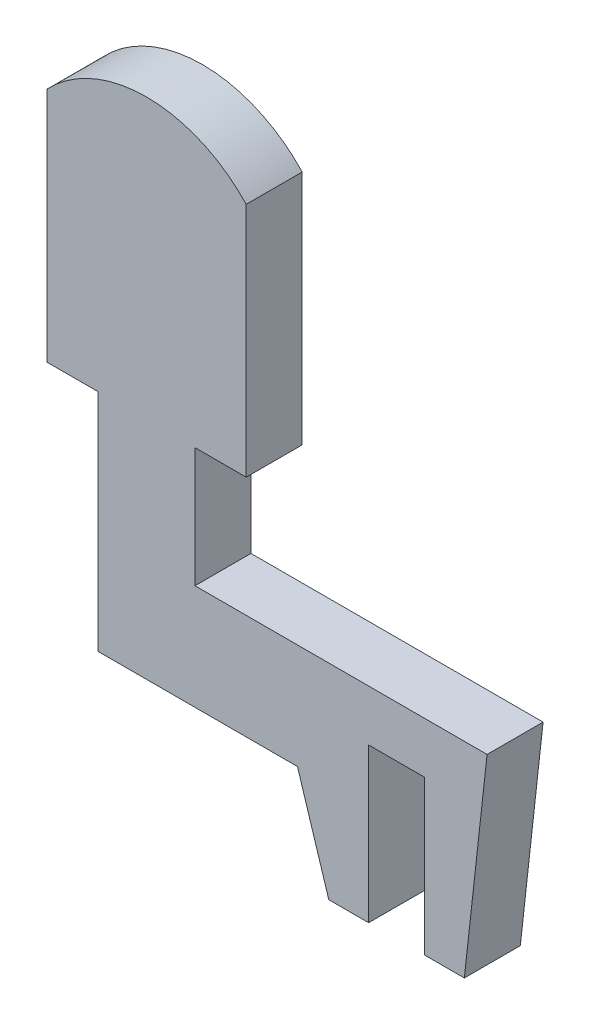
ISO-10303-21;
HEADER;
FILE_DESCRIPTION(('STEP AP214'),'2;1');
FILE_NAME('part.step','',(''),(''),'','','');
FILE_SCHEMA(('AUTOMOTIVE_DESIGN { 1 0 10303 214 1 1 1 1 }'));
ENDSEC;
DATA;
#1=APPLICATION_CONTEXT('core data for automotive mechanical design processes');
#2=APPLICATION_PROTOCOL_DEFINITION('international standard','automotive_design',2000,#1);
#3=PRODUCT_CONTEXT('',#1,'mechanical');
#4=PRODUCT('Part','Part','',(#3));
#5=PRODUCT_RELATED_PRODUCT_CATEGORY('part','',(#4));
#6=PRODUCT_DEFINITION_FORMATION('','',#4);
#7=PRODUCT_DEFINITION_CONTEXT('part definition',#1,'design');
#8=PRODUCT_DEFINITION('design','',#6,#7);
#9=PRODUCT_DEFINITION_SHAPE('','',#8);
#10=(LENGTH_UNIT() NAMED_UNIT(*) SI_UNIT(.MILLI.,.METRE.));
#11=(NAMED_UNIT(*) PLANE_ANGLE_UNIT() SI_UNIT($,.RADIAN.));
#12=(NAMED_UNIT(*) SI_UNIT($,.STERADIAN.) SOLID_ANGLE_UNIT());
#13=UNCERTAINTY_MEASURE_WITH_UNIT(LENGTH_MEASURE(1.E-05),#10,'distance_accuracy_value','');
#14=(GEOMETRIC_REPRESENTATION_CONTEXT(3) GLOBAL_UNCERTAINTY_ASSIGNED_CONTEXT((#13)) GLOBAL_UNIT_ASSIGNED_CONTEXT((#10,
#11,#12)) REPRESENTATION_CONTEXT('',''));
#15=CARTESIAN_POINT('',(0.,0.,0.));
#16=DIRECTION('',(0.,0.,1.));
#17=DIRECTION('',(1.,0.,0.));
#18=AXIS2_PLACEMENT_3D('',#15,#16,#17);
#19=CARTESIAN_POINT('',(540.410759595773,46.3627302296333,3.));
#20=DIRECTION('',(0.,1.,0.));
#21=DIRECTION('',(0.,0.,1.));
#22=AXIS2_PLACEMENT_3D('',#19,#20,#21);
#23=PLANE('',#22);
#24=DIRECTION('',(1.,0.,0.));
#25=VECTOR('',#24,1.);
#26=CARTESIAN_POINT('',(540.410759595773,46.3627302296333,0.));
#27=LINE('',#26,#25);
#28=CARTESIAN_POINT('',(540.410759595773,46.3627302296333,0.));
#29=VERTEX_POINT('',#28);
#30=CARTESIAN_POINT('',(543.156662917581,46.3627302296333,0.));
#31=VERTEX_POINT('',#30);
#32=EDGE_CURVE('E148',#29,#31,#27,.T.);
#33=ORIENTED_EDGE('',*,*,#32,.T.);
#34=DIRECTION('',(0.,0.,-1.));
#35=VECTOR('',#34,1.);
#36=CARTESIAN_POINT('',(543.156662917581,46.3627302296333,2.99999999999995));
#37=LINE('',#36,#35);
#38=CARTESIAN_POINT('',(543.156662917581,46.3627302296333,2.99999999999995));
#39=VERTEX_POINT('',#38);
#40=EDGE_CURVE('E11',#39,#31,#37,.T.);
#41=ORIENTED_EDGE('',*,*,#40,.F.);
#42=DIRECTION('',(1.,0.,0.));
#43=VECTOR('',#42,1.);
#44=CARTESIAN_POINT('',(540.410759595773,46.3627302296333,3.));
#45=LINE('',#44,#43);
#46=CARTESIAN_POINT('',(540.410759595773,46.3627302296333,3.));
#47=VERTEX_POINT('',#46);
#48=EDGE_CURVE('E191',#47,#39,#45,.T.);
#49=ORIENTED_EDGE('',*,*,#48,.F.);
#50=DIRECTION('',(0.,0.,-1.));
#51=VECTOR('',#50,1.);
#52=CARTESIAN_POINT('',(540.410759595773,46.3627302296333,3.));
#53=LINE('',#52,#51);
#54=EDGE_CURVE('E161',#47,#29,#53,.T.);
#55=ORIENTED_EDGE('',*,*,#54,.T.);
#56=EDGE_LOOP('',(#33,#41,#49,#55));
#57=FACE_BOUND('',#56,.T.);
#58=ADVANCED_FACE('F32',(#57),#23,.F.);
#59=CARTESIAN_POINT('',(543.156662917581,46.3627302296333,2.99999999999995));
#60=DIRECTION('',(-1.,0.,0.));
#61=DIRECTION('',(0.,0.,1.));
#62=AXIS2_PLACEMENT_3D('',#59,#60,#61);
#63=PLANE('',#62);
#64=DIRECTION('',(0.,1.,0.));
#65=VECTOR('',#64,1.);
#66=CARTESIAN_POINT('',(543.156662917581,46.3627302296333,0.));
#67=LINE('',#66,#65);
#68=CARTESIAN_POINT('',(543.156662917581,59.0243100628023,0.));
#69=VERTEX_POINT('',#68);
#70=EDGE_CURVE('E144',#31,#69,#67,.T.);
#71=ORIENTED_EDGE('',*,*,#70,.T.);
#72=DIRECTION('',(0.,0.,-1.));
#73=VECTOR('',#72,1.);
#74=CARTESIAN_POINT('',(543.156662917581,59.0243100628023,2.99999999999998));
#75=LINE('',#74,#73);
#76=CARTESIAN_POINT('',(543.156662917581,59.0243100628023,2.99999999999998));
#77=VERTEX_POINT('',#76);
#78=EDGE_CURVE('E39',#77,#69,#75,.T.);
#79=ORIENTED_EDGE('',*,*,#78,.F.);
#80=DIRECTION('',(0.,1.,0.));
#81=VECTOR('',#80,1.);
#82=CARTESIAN_POINT('',(543.156662917581,46.3627302296333,2.99999999999995));
#83=LINE('',#82,#81);
#84=EDGE_CURVE('E157',#39,#77,#83,.T.);
#85=ORIENTED_EDGE('',*,*,#84,.F.);
#86=ORIENTED_EDGE('',*,*,#40,.T.);
#87=EDGE_LOOP('',(#71,#79,#85,#86));
#88=FACE_BOUND('',#87,.T.);
#89=ADVANCED_FACE('F156',(#88),#63,.F.);
#90=CARTESIAN_POINT('',(537.817433657982,54.0155561595769,2.99999999999998));
#91=DIRECTION('',(0.,0.,-1.));
#92=DIRECTION('',(-1.,0.,0.));
#93=AXIS2_PLACEMENT_3D('',#90,#91,#92);
#94=CYLINDRICAL_SURFACE('',#93,7.32085956357776);
#95=CARTESIAN_POINT('',(537.817433657982,54.0155561595769,0.));
#96=DIRECTION('',(0.,0.,1.));
#97=DIRECTION('',(1.,0.,0.));
#98=AXIS2_PLACEMENT_3D('',#95,#96,#97);
#99=CIRCLE('',#98,7.32085956357776);
#100=CARTESIAN_POINT('',(532.478204398384,59.0243100628022,0.));
#101=VERTEX_POINT('',#100);
#102=EDGE_CURVE('E150',#69,#101,#99,.T.);
#103=ORIENTED_EDGE('',*,*,#102,.T.);
#104=DIRECTION('',(0.,0.,-1.));
#105=VECTOR('',#104,1.);
#106=CARTESIAN_POINT('',(532.478204398384,59.0243100628023,2.99999999999998));
#107=LINE('',#106,#105);
#108=CARTESIAN_POINT('',(532.478204398384,59.0243100628023,2.99999999999998));
#109=VERTEX_POINT('',#108);
#110=EDGE_CURVE('E257',#109,#101,#107,.T.);
#111=ORIENTED_EDGE('',*,*,#110,.F.);
#112=CARTESIAN_POINT('',(537.817433657982,54.0155561595769,2.99999999999998));
#113=DIRECTION('',(0.,0.,1.));
#114=DIRECTION('',(1.,0.,0.));
#115=AXIS2_PLACEMENT_3D('',#112,#113,#114);
#116=CIRCLE('',#115,7.32085956357776);
#117=EDGE_CURVE('E194',#77,#109,#116,.T.);
#118=ORIENTED_EDGE('',*,*,#117,.F.);
#119=ORIENTED_EDGE('',*,*,#78,.T.);
#120=EDGE_LOOP('',(#103,#111,#118,#119));
#121=FACE_BOUND('',#120,.T.);
#122=ADVANCED_FACE('F261',(#121),#94,.T.);
#123=CARTESIAN_POINT('',(532.478204398384,46.3627302296333,3.));
#124=DIRECTION('',(1.,0.,0.));
#125=DIRECTION('',(0.,0.,-1.));
#126=AXIS2_PLACEMENT_3D('',#123,#124,#125);
#127=PLANE('',#126);
#128=DIRECTION('',(0.,-1.,0.));
#129=VECTOR('',#128,1.);
#130=CARTESIAN_POINT('',(532.478204398384,46.3627302296333,0.));
#131=LINE('',#130,#129);
#132=CARTESIAN_POINT('',(532.478204398384,46.3627302296333,0.));
#133=VERTEX_POINT('',#132);
#134=EDGE_CURVE('E165',#101,#133,#131,.T.);
#135=ORIENTED_EDGE('',*,*,#134,.T.);
#136=DIRECTION('',(0.,0.,-1.));
#137=VECTOR('',#136,1.);
#138=CARTESIAN_POINT('',(532.478204398384,46.3627302296333,3.));
#139=LINE('',#138,#137);
#140=CARTESIAN_POINT('',(532.478204398384,46.3627302296333,3.));
#141=VERTEX_POINT('',#140);
#142=EDGE_CURVE('E254',#141,#133,#139,.T.);
#143=ORIENTED_EDGE('',*,*,#142,.F.);
#144=DIRECTION('',(0.,-1.,0.));
#145=VECTOR('',#144,1.);
#146=CARTESIAN_POINT('',(532.478204398384,46.5152726429004,3.));
#147=LINE('',#146,#145);
#148=EDGE_CURVE('E196',#109,#141,#147,.T.);
#149=ORIENTED_EDGE('',*,*,#148,.F.);
#150=ORIENTED_EDGE('',*,*,#110,.T.);
#151=EDGE_LOOP('',(#135,#143,#149,#150));
#152=FACE_BOUND('',#151,.T.);
#153=ADVANCED_FACE('F269',(#152),#127,.F.);
#154=CARTESIAN_POINT('',(535.224107720192,46.3627302296333,2.99999999999998));
#155=DIRECTION('',(0.,1.,0.));
#156=DIRECTION('',(0.,0.,1.));
#157=AXIS2_PLACEMENT_3D('',#154,#155,#156);
#158=PLANE('',#157);
#159=DIRECTION('',(1.,0.,0.));
#160=VECTOR('',#159,1.);
#161=CARTESIAN_POINT('',(535.224107720192,46.3627302296333,0.));
#162=LINE('',#161,#160);
#163=CARTESIAN_POINT('',(535.224107720192,46.3627302296333,0.));
#164=VERTEX_POINT('',#163);
#165=EDGE_CURVE('E167',#133,#164,#162,.T.);
#166=ORIENTED_EDGE('',*,*,#165,.T.);
#167=DIRECTION('',(0.,0.,-1.));
#168=VECTOR('',#167,1.);
#169=CARTESIAN_POINT('',(535.224107720192,46.3627302296333,2.99999999999998));
#170=LINE('',#169,#168);
#171=CARTESIAN_POINT('',(535.224107720192,46.3627302296333,2.99999999999998));
#172=VERTEX_POINT('',#171);
#173=EDGE_CURVE('E251',#172,#164,#170,.T.);
#174=ORIENTED_EDGE('',*,*,#173,.F.);
#175=DIRECTION('',(1.,0.,0.));
#176=VECTOR('',#175,1.);
#177=CARTESIAN_POINT('',(535.224107720192,46.3627302296333,2.99999999999998));
#178=LINE('',#177,#176);
#179=EDGE_CURVE('E198',#141,#172,#178,.T.);
#180=ORIENTED_EDGE('',*,*,#179,.F.);
#181=ORIENTED_EDGE('',*,*,#142,.T.);
#182=EDGE_LOOP('',(#166,#174,#180,#181));
#183=FACE_BOUND('',#182,.T.);
#184=ADVANCED_FACE('F272',(#183),#158,.F.);
#185=CARTESIAN_POINT('',(535.224107720192,34.3112501080318,2.99999999999997));
#186=DIRECTION('',(1.,0.,0.));
#187=DIRECTION('',(0.,0.,-1.));
#188=AXIS2_PLACEMENT_3D('',#185,#186,#187);
#189=PLANE('',#188);
#190=DIRECTION('',(0.,-1.,0.));
#191=VECTOR('',#190,1.);
#192=CARTESIAN_POINT('',(535.224107720192,34.3112501080318,0.));
#193=LINE('',#192,#191);
#194=CARTESIAN_POINT('',(535.224107720192,34.3112501080318,0.));
#195=VERTEX_POINT('',#194);
#196=EDGE_CURVE('E169',#164,#195,#193,.T.);
#197=ORIENTED_EDGE('',*,*,#196,.T.);
#198=DIRECTION('',(0.,0.,-1.));
#199=VECTOR('',#198,1.);
#200=CARTESIAN_POINT('',(535.224107720192,34.3112501080318,2.99999999999997));
#201=LINE('',#200,#199);
#202=CARTESIAN_POINT('',(535.224107720192,34.3112501080318,2.99999999999997));
#203=VERTEX_POINT('',#202);
#204=EDGE_CURVE('E248',#203,#195,#201,.T.);
#205=ORIENTED_EDGE('',*,*,#204,.F.);
#206=DIRECTION('',(0.,-1.,0.));
#207=VECTOR('',#206,1.);
#208=CARTESIAN_POINT('',(535.224107720192,34.3112501080318,2.99999999999997));
#209=LINE('',#208,#207);
#210=EDGE_CURVE('E200',#172,#203,#209,.T.);
#211=ORIENTED_EDGE('',*,*,#210,.F.);
#212=ORIENTED_EDGE('',*,*,#173,.T.);
#213=EDGE_LOOP('',(#197,#205,#211,#212));
#214=FACE_BOUND('',#213,.T.);
#215=ADVANCED_FACE('F277',(#214),#189,.F.);
#216=CARTESIAN_POINT('',(545.902566239388,34.3112501080318,2.99999999999999));
#217=DIRECTION('',(0.,1.,0.));
#218=DIRECTION('',(0.,0.,1.));
#219=AXIS2_PLACEMENT_3D('',#216,#217,#218);
#220=PLANE('',#219);
#221=DIRECTION('',(1.,0.,0.));
#222=VECTOR('',#221,1.);
#223=CARTESIAN_POINT('',(545.902566239388,34.3112501080318,0.));
#224=LINE('',#223,#222);
#225=CARTESIAN_POINT('',(545.902566239388,34.3112501080318,0.));
#226=VERTEX_POINT('',#225);
#227=EDGE_CURVE('E171',#195,#226,#224,.T.);
#228=ORIENTED_EDGE('',*,*,#227,.T.);
#229=DIRECTION('',(0.,0.,-1.));
#230=VECTOR('',#229,1.);
#231=CARTESIAN_POINT('',(545.902566239388,34.3112501080318,2.99999999999999));
#232=LINE('',#231,#230);
#233=CARTESIAN_POINT('',(545.902566239388,34.3112501080318,2.99999999999999));
#234=VERTEX_POINT('',#233);
#235=EDGE_CURVE('E245',#234,#226,#232,.T.);
#236=ORIENTED_EDGE('',*,*,#235,.F.);
#237=DIRECTION('',(1.,0.,0.));
#238=VECTOR('',#237,1.);
#239=CARTESIAN_POINT('',(545.902566239388,34.3112501080318,2.99999999999999));
#240=LINE('',#239,#238);
#241=EDGE_CURVE('E202',#203,#234,#240,.T.);
#242=ORIENTED_EDGE('',*,*,#241,.F.);
#243=ORIENTED_EDGE('',*,*,#204,.T.);
#244=EDGE_LOOP('',(#228,#236,#242,#243));
#245=FACE_BOUND('',#244,.T.);
#246=ADVANCED_FACE('F283',(#245),#220,.F.);
#247=CARTESIAN_POINT('',(547.580602726826,28.9720558191837,2.99999999999998));
#248=DIRECTION('',(0.953993512641534,0.299827246656918,0.));
#249=DIRECTION('',(-0.299827246656918,0.953993512641533,0.));
#250=AXIS2_PLACEMENT_3D('',#247,#248,#249);
#251=PLANE('',#250);
#252=DIRECTION('',(0.299827246656918,-0.953993512641533,0.));
#253=VECTOR('',#252,1.);
#254=CARTESIAN_POINT('',(547.580602726826,28.9720558191837,0.));
#255=LINE('',#254,#253);
#256=CARTESIAN_POINT('',(547.580602726826,28.9720558191837,0.));
#257=VERTEX_POINT('',#256);
#258=EDGE_CURVE('E173',#226,#257,#255,.T.);
#259=ORIENTED_EDGE('',*,*,#258,.T.);
#260=DIRECTION('',(0.,0.,-1.));
#261=VECTOR('',#260,1.);
#262=CARTESIAN_POINT('',(547.580602726826,28.9720558191837,2.99999999999998));
#263=LINE('',#262,#261);
#264=CARTESIAN_POINT('',(547.580602726826,28.9720558191837,2.99999999999998));
#265=VERTEX_POINT('',#264);
#266=EDGE_CURVE('E242',#265,#257,#263,.T.);
#267=ORIENTED_EDGE('',*,*,#266,.F.);
#268=DIRECTION('',(0.299827246656918,-0.953993512641533,0.));
#269=VECTOR('',#268,1.);
#270=CARTESIAN_POINT('',(547.580602726826,28.9720558191837,2.99999999999998));
#271=LINE('',#270,#269);
#272=EDGE_CURVE('E204',#234,#265,#271,.T.);
#273=ORIENTED_EDGE('',*,*,#272,.F.);
#274=ORIENTED_EDGE('',*,*,#235,.T.);
#275=EDGE_LOOP('',(#259,#267,#273,#274));
#276=FACE_BOUND('',#275,.T.);
#277=ADVANCED_FACE('F287',(#276),#251,.F.);
#278=CARTESIAN_POINT('',(549.71493756555,28.9698176911579,2.99999999999999));
#279=DIRECTION('',(0.00104862965018185,0.999999450187777,0.));
#280=DIRECTION('',(-0.999999450187778,0.0010486296501819,0.));
#281=AXIS2_PLACEMENT_3D('',#278,#279,#280);
#282=PLANE('',#281);
#283=DIRECTION('',(0.999999450187778,-0.00104862965018185,0.));
#284=VECTOR('',#283,1.);
#285=CARTESIAN_POINT('',(549.71493756555,28.9698176911579,0.));
#286=LINE('',#285,#284);
#287=CARTESIAN_POINT('',(549.71493756555,28.9698176911579,0.));
#288=VERTEX_POINT('',#287);
#289=EDGE_CURVE('E175',#257,#288,#286,.T.);
#290=ORIENTED_EDGE('',*,*,#289,.T.);
#291=DIRECTION('',(0.,0.,-1.));
#292=VECTOR('',#291,1.);
#293=CARTESIAN_POINT('',(549.71493756555,28.9698176911579,2.99999999999999));
#294=LINE('',#293,#292);
#295=CARTESIAN_POINT('',(549.71493756555,28.9698176911579,2.99999999999999));
#296=VERTEX_POINT('',#295);
#297=EDGE_CURVE('E239',#296,#288,#294,.T.);
#298=ORIENTED_EDGE('',*,*,#297,.F.);
#299=DIRECTION('',(0.999999450187778,-0.00104862965018185,0.));
#300=VECTOR('',#299,1.);
#301=CARTESIAN_POINT('',(549.71493756555,28.9698176911579,2.99999999999999));
#302=LINE('',#301,#300);
#303=EDGE_CURVE('E206',#265,#296,#302,.T.);
#304=ORIENTED_EDGE('',*,*,#303,.F.);
#305=ORIENTED_EDGE('',*,*,#266,.T.);
#306=EDGE_LOOP('',(#290,#298,#304,#305));
#307=FACE_BOUND('',#306,.T.);
#308=ADVANCED_FACE('F292',(#307),#282,.F.);
#309=CARTESIAN_POINT('',(549.71493756555,37.2198176911579,3.));
#310=DIRECTION('',(-1.,0.,0.));
#311=DIRECTION('',(0.,0.,1.));
#312=AXIS2_PLACEMENT_3D('',#309,#310,#311);
#313=PLANE('',#312);
#314=DIRECTION('',(0.,1.,0.));
#315=VECTOR('',#314,1.);
#316=CARTESIAN_POINT('',(549.71493756555,37.2198176911578,0.));
#317=LINE('',#316,#315);
#318=CARTESIAN_POINT('',(549.71493756555,37.2198176911578,0.));
#319=VERTEX_POINT('',#318);
#320=EDGE_CURVE('E177',#288,#319,#317,.T.);
#321=ORIENTED_EDGE('',*,*,#320,.T.);
#322=DIRECTION('',(0.,0.,-1.));
#323=VECTOR('',#322,1.);
#324=CARTESIAN_POINT('',(549.71493756555,37.2198176911579,3.));
#325=LINE('',#324,#323);
#326=CARTESIAN_POINT('',(549.71493756555,37.2198176911579,3.));
#327=VERTEX_POINT('',#326);
#328=EDGE_CURVE('E236',#327,#319,#325,.T.);
#329=ORIENTED_EDGE('',*,*,#328,.F.);
#330=DIRECTION('',(0.,1.,0.));
#331=VECTOR('',#330,1.);
#332=CARTESIAN_POINT('',(549.71493756555,37.2198176911579,3.));
#333=LINE('',#332,#331);
#334=EDGE_CURVE('E208',#296,#327,#333,.T.);
#335=ORIENTED_EDGE('',*,*,#334,.F.);
#336=ORIENTED_EDGE('',*,*,#297,.T.);
#337=EDGE_LOOP('',(#321,#329,#335,#336));
#338=FACE_BOUND('',#337,.T.);
#339=ADVANCED_FACE('F298',(#338),#313,.F.);
#340=CARTESIAN_POINT('',(552.71493756555,37.2198176911578,2.99999999999999));
#341=DIRECTION('',(0.,1.,0.));
#342=DIRECTION('',(0.,0.,1.));
#343=AXIS2_PLACEMENT_3D('',#340,#341,#342);
#344=PLANE('',#343);
#345=DIRECTION('',(1.,0.,0.));
#346=VECTOR('',#345,1.);
#347=CARTESIAN_POINT('',(552.71493756555,37.2198176911578,0.));
#348=LINE('',#347,#346);
#349=CARTESIAN_POINT('',(552.71493756555,37.2198176911578,0.));
#350=VERTEX_POINT('',#349);
#351=EDGE_CURVE('E179',#319,#350,#348,.T.);
#352=ORIENTED_EDGE('',*,*,#351,.T.);
#353=DIRECTION('',(0.,0.,-1.));
#354=VECTOR('',#353,1.);
#355=CARTESIAN_POINT('',(552.71493756555,37.2198176911578,2.99999999999999));
#356=LINE('',#355,#354);
#357=CARTESIAN_POINT('',(552.71493756555,37.2198176911578,2.99999999999999));
#358=VERTEX_POINT('',#357);
#359=EDGE_CURVE('E233',#358,#350,#356,.T.);
#360=ORIENTED_EDGE('',*,*,#359,.F.);
#361=DIRECTION('',(1.,0.,0.));
#362=VECTOR('',#361,1.);
#363=CARTESIAN_POINT('',(552.71493756555,37.2198176911578,2.99999999999999));
#364=LINE('',#363,#362);
#365=EDGE_CURVE('E210',#327,#358,#364,.T.);
#366=ORIENTED_EDGE('',*,*,#365,.F.);
#367=ORIENTED_EDGE('',*,*,#328,.T.);
#368=EDGE_LOOP('',(#352,#360,#366,#367));
#369=FACE_BOUND('',#368,.T.);
#370=ADVANCED_FACE('F302',(#369),#344,.F.);
#371=CARTESIAN_POINT('',(552.70789796037,28.9698206945548,2.99999999999998));
#372=DIRECTION('',(0.999999635951882,-0.000853285476404508,0.));
#373=DIRECTION('',(0.000853285476404425,0.999999635951882,0.));
#374=AXIS2_PLACEMENT_3D('',#371,#372,#373);
#375=PLANE('',#374);
#376=DIRECTION('',(-0.000853285476404453,-0.999999635951881,0.));
#377=VECTOR('',#376,1.);
#378=CARTESIAN_POINT('',(552.70789796037,28.9698206945548,0.));
#379=LINE('',#378,#377);
#380=CARTESIAN_POINT('',(552.70789796037,28.9698206945548,0.));
#381=VERTEX_POINT('',#380);
#382=EDGE_CURVE('E181',#350,#381,#379,.T.);
#383=ORIENTED_EDGE('',*,*,#382,.T.);
#384=DIRECTION('',(0.,0.,-1.));
#385=VECTOR('',#384,1.);
#386=CARTESIAN_POINT('',(552.70789796037,28.9698206945548,2.99999999999998));
#387=LINE('',#386,#385);
#388=CARTESIAN_POINT('',(552.70789796037,28.9698206945548,2.99999999999998));
#389=VERTEX_POINT('',#388);
#390=EDGE_CURVE('E230',#389,#381,#387,.T.);
#391=ORIENTED_EDGE('',*,*,#390,.F.);
#392=DIRECTION('',(-0.000853285476404453,-0.999999635951881,0.));
#393=VECTOR('',#392,1.);
#394=CARTESIAN_POINT('',(552.70789796037,28.9698206945548,2.99999999999998));
#395=LINE('',#394,#393);
#396=EDGE_CURVE('E212',#358,#389,#395,.T.);
#397=ORIENTED_EDGE('',*,*,#396,.F.);
#398=ORIENTED_EDGE('',*,*,#359,.T.);
#399=EDGE_LOOP('',(#383,#391,#397,#398));
#400=FACE_BOUND('',#399,.T.);
#401=ADVANCED_FACE('F307',(#400),#375,.F.);
#402=CARTESIAN_POINT('',(554.842233972577,28.9698206945548,2.99999999999998));
#403=DIRECTION('',(0.,1.,0.));
#404=DIRECTION('',(-1.,0.,0.));
#405=AXIS2_PLACEMENT_3D('',#402,#403,#404);
#406=PLANE('',#405);
#407=DIRECTION('',(1.,0.,0.));
#408=VECTOR('',#407,1.);
#409=CARTESIAN_POINT('',(554.842233972577,28.9698206945548,0.));
#410=LINE('',#409,#408);
#411=CARTESIAN_POINT('',(554.842233972577,28.9698206945548,0.));
#412=VERTEX_POINT('',#411);
#413=EDGE_CURVE('E183',#381,#412,#410,.T.);
#414=ORIENTED_EDGE('',*,*,#413,.T.);
#415=DIRECTION('',(0.,0.,-1.));
#416=VECTOR('',#415,1.);
#417=CARTESIAN_POINT('',(554.842233972577,28.9698206945548,2.99999999999998));
#418=LINE('',#417,#416);
#419=CARTESIAN_POINT('',(554.842233972577,28.9698206945548,2.99999999999998));
#420=VERTEX_POINT('',#419);
#421=EDGE_CURVE('E227',#420,#412,#418,.T.);
#422=ORIENTED_EDGE('',*,*,#421,.F.);
#423=DIRECTION('',(1.,0.,0.));
#424=VECTOR('',#423,1.);
#425=CARTESIAN_POINT('',(554.842233972577,28.9698206945548,2.99999999999998));
#426=LINE('',#425,#424);
#427=EDGE_CURVE('E214',#389,#420,#426,.T.);
#428=ORIENTED_EDGE('',*,*,#427,.F.);
#429=ORIENTED_EDGE('',*,*,#390,.T.);
#430=EDGE_LOOP('',(#414,#422,#428,#429));
#431=FACE_BOUND('',#430,.T.);
#432=ADVANCED_FACE('F313',(#431),#406,.F.);
#433=CARTESIAN_POINT('',(556.062643220214,39.9533640402858,3.00000000000002));
#434=DIRECTION('',(-0.993883580309317,0.11043291534472,0.));
#435=DIRECTION('',(-0.110432915344721,-0.993883580309316,0.));
#436=AXIS2_PLACEMENT_3D('',#433,#434,#435);
#437=PLANE('',#436);
#438=DIRECTION('',(0.110432915344721,0.993883580309316,0.));
#439=VECTOR('',#438,1.);
#440=CARTESIAN_POINT('',(556.062643220214,39.9533640402858,0.));
#441=LINE('',#440,#439);
#442=CARTESIAN_POINT('',(556.062643220214,39.9533640402858,0.));
#443=VERTEX_POINT('',#442);
#444=EDGE_CURVE('E185',#412,#443,#441,.T.);
#445=ORIENTED_EDGE('',*,*,#444,.T.);
#446=DIRECTION('',(0.,0.,-1.));
#447=VECTOR('',#446,1.);
#448=CARTESIAN_POINT('',(556.062643220214,39.9533640402858,3.00000000000002));
#449=LINE('',#448,#447);
#450=CARTESIAN_POINT('',(556.062643220214,39.9533640402858,3.00000000000002));
#451=VERTEX_POINT('',#450);
#452=EDGE_CURVE('E224',#451,#443,#449,.T.);
#453=ORIENTED_EDGE('',*,*,#452,.F.);
#454=DIRECTION('',(0.110432915344721,0.993883580309316,0.));
#455=VECTOR('',#454,1.);
#456=CARTESIAN_POINT('',(556.062643220214,39.9533640402858,3.00000000000002));
#457=LINE('',#456,#455);
#458=EDGE_CURVE('E216',#420,#451,#457,.T.);
#459=ORIENTED_EDGE('',*,*,#458,.F.);
#460=ORIENTED_EDGE('',*,*,#421,.T.);
#461=EDGE_LOOP('',(#445,#453,#459,#460));
#462=FACE_BOUND('',#461,.T.);
#463=ADVANCED_FACE('F317',(#462),#437,.F.);
#464=CARTESIAN_POINT('',(540.410759595773,39.9533640402857,3.00000000000002));
#465=DIRECTION('',(0.,-1.,0.));
#466=DIRECTION('',(0.,0.,-1.));
#467=AXIS2_PLACEMENT_3D('',#464,#465,#466);
#468=PLANE('',#467);
#469=DIRECTION('',(-1.,0.,0.));
#470=VECTOR('',#469,1.);
#471=CARTESIAN_POINT('',(540.410759595773,39.9533640402857,0.));
#472=LINE('',#471,#470);
#473=CARTESIAN_POINT('',(540.410759595773,39.9533640402857,0.));
#474=VERTEX_POINT('',#473);
#475=EDGE_CURVE('E187',#443,#474,#472,.T.);
#476=ORIENTED_EDGE('',*,*,#475,.T.);
#477=DIRECTION('',(0.,0.,-1.));
#478=VECTOR('',#477,1.);
#479=CARTESIAN_POINT('',(540.410759595773,39.9533640402857,3.00000000000002));
#480=LINE('',#479,#478);
#481=CARTESIAN_POINT('',(540.410759595773,39.9533640402857,3.00000000000002));
#482=VERTEX_POINT('',#481);
#483=EDGE_CURVE('E221',#482,#474,#480,.T.);
#484=ORIENTED_EDGE('',*,*,#483,.F.);
#485=DIRECTION('',(-1.,0.,0.));
#486=VECTOR('',#485,1.);
#487=CARTESIAN_POINT('',(540.410759595773,39.9533640402857,3.00000000000002));
#488=LINE('',#487,#486);
#489=EDGE_CURVE('E51',#451,#482,#488,.T.);
#490=ORIENTED_EDGE('',*,*,#489,.F.);
#491=ORIENTED_EDGE('',*,*,#452,.T.);
#492=EDGE_LOOP('',(#476,#484,#490,#491));
#493=FACE_BOUND('',#492,.T.);
#494=ADVANCED_FACE('F320',(#493),#468,.F.);
#495=CARTESIAN_POINT('',(540.410759595773,46.3627302296333,3.));
#496=DIRECTION('',(-1.,0.,0.));
#497=DIRECTION('',(0.,0.,1.));
#498=AXIS2_PLACEMENT_3D('',#495,#496,#497);
#499=PLANE('',#498);
#500=DIRECTION('',(0.,1.,0.));
#501=VECTOR('',#500,1.);
#502=CARTESIAN_POINT('',(540.410759595773,46.3627302296333,0.));
#503=LINE('',#502,#501);
#504=EDGE_CURVE('E189',#474,#29,#503,.T.);
#505=ORIENTED_EDGE('',*,*,#504,.T.);
#506=ORIENTED_EDGE('',*,*,#54,.F.);
#507=DIRECTION('',(0.,1.,0.));
#508=VECTOR('',#507,1.);
#509=CARTESIAN_POINT('',(540.410759595773,46.3627302296333,3.));
#510=LINE('',#509,#508);
#511=EDGE_CURVE('E46',#482,#47,#510,.T.);
#512=ORIENTED_EDGE('',*,*,#511,.F.);
#513=ORIENTED_EDGE('',*,*,#483,.T.);
#514=EDGE_LOOP('',(#505,#506,#512,#513));
#515=FACE_BOUND('',#514,.T.);
#516=ADVANCED_FACE('F322',(#515),#499,.F.);
#517=CARTESIAN_POINT('',(537.817433657982,54.0155561595769,2.99999999999998));
#518=DIRECTION('',(0.,0.,1.));
#519=DIRECTION('',(1.,0.,0.));
#520=AXIS2_PLACEMENT_3D('',#517,#518,#519);
#521=PLANE('',#520);
#522=ORIENTED_EDGE('',*,*,#48,.T.);
#523=ORIENTED_EDGE('',*,*,#84,.T.);
#524=ORIENTED_EDGE('',*,*,#117,.T.);
#525=ORIENTED_EDGE('',*,*,#148,.T.);
#526=ORIENTED_EDGE('',*,*,#179,.T.);
#527=ORIENTED_EDGE('',*,*,#210,.T.);
#528=ORIENTED_EDGE('',*,*,#241,.T.);
#529=ORIENTED_EDGE('',*,*,#272,.T.);
#530=ORIENTED_EDGE('',*,*,#303,.T.);
#531=ORIENTED_EDGE('',*,*,#334,.T.);
#532=ORIENTED_EDGE('',*,*,#365,.T.);
#533=ORIENTED_EDGE('',*,*,#396,.T.);
#534=ORIENTED_EDGE('',*,*,#427,.T.);
#535=ORIENTED_EDGE('',*,*,#458,.T.);
#536=ORIENTED_EDGE('',*,*,#489,.T.);
#537=ORIENTED_EDGE('',*,*,#511,.T.);
#538=EDGE_LOOP('',(#522,#523,#524,#525,#526,#527,#528,#529,#530,#531,#532,#533,#534,#535,#536,#537));
#539=FACE_BOUND('',#538,.T.);
#540=ADVANCED_FACE('F264',(#539),#521,.T.);
#541=CARTESIAN_POINT('',(537.817433657982,54.0155561595769,0.));
#542=DIRECTION('',(0.,0.,1.));
#543=DIRECTION('',(1.,0.,0.));
#544=AXIS2_PLACEMENT_3D('',#541,#542,#543);
#545=PLANE('',#544);
#546=ORIENTED_EDGE('',*,*,#32,.F.);
#547=ORIENTED_EDGE('',*,*,#504,.F.);
#548=ORIENTED_EDGE('',*,*,#475,.F.);
#549=ORIENTED_EDGE('',*,*,#444,.F.);
#550=ORIENTED_EDGE('',*,*,#413,.F.);
#551=ORIENTED_EDGE('',*,*,#382,.F.);
#552=ORIENTED_EDGE('',*,*,#351,.F.);
#553=ORIENTED_EDGE('',*,*,#320,.F.);
#554=ORIENTED_EDGE('',*,*,#289,.F.);
#555=ORIENTED_EDGE('',*,*,#258,.F.);
#556=ORIENTED_EDGE('',*,*,#227,.F.);
#557=ORIENTED_EDGE('',*,*,#196,.F.);
#558=ORIENTED_EDGE('',*,*,#165,.F.);
#559=ORIENTED_EDGE('',*,*,#134,.F.);
#560=ORIENTED_EDGE('',*,*,#102,.F.);
#561=ORIENTED_EDGE('',*,*,#70,.F.);
#562=EDGE_LOOP('',(#546,#547,#548,#549,#550,#551,#552,#553,#554,#555,#556,#557,#558,#559,#560,#561));
#563=FACE_BOUND('',#562,.T.);
#564=ADVANCED_FACE('F145',(#563),#545,.F.);
#565=CLOSED_SHELL('',(#58,#89,#122,#153,#184,#215,#246,#277,#308,#339,#370,#401,#432,#463,#494,
#516,#540,#564));
#566=MANIFOLD_SOLID_BREP('B2',#565);
#567=ADVANCED_BREP_SHAPE_REPRESENTATION('',(#18,#566),#14);
#568=SHAPE_DEFINITION_REPRESENTATION(#9,#567);
ENDSEC;
END-ISO-10303-21;
